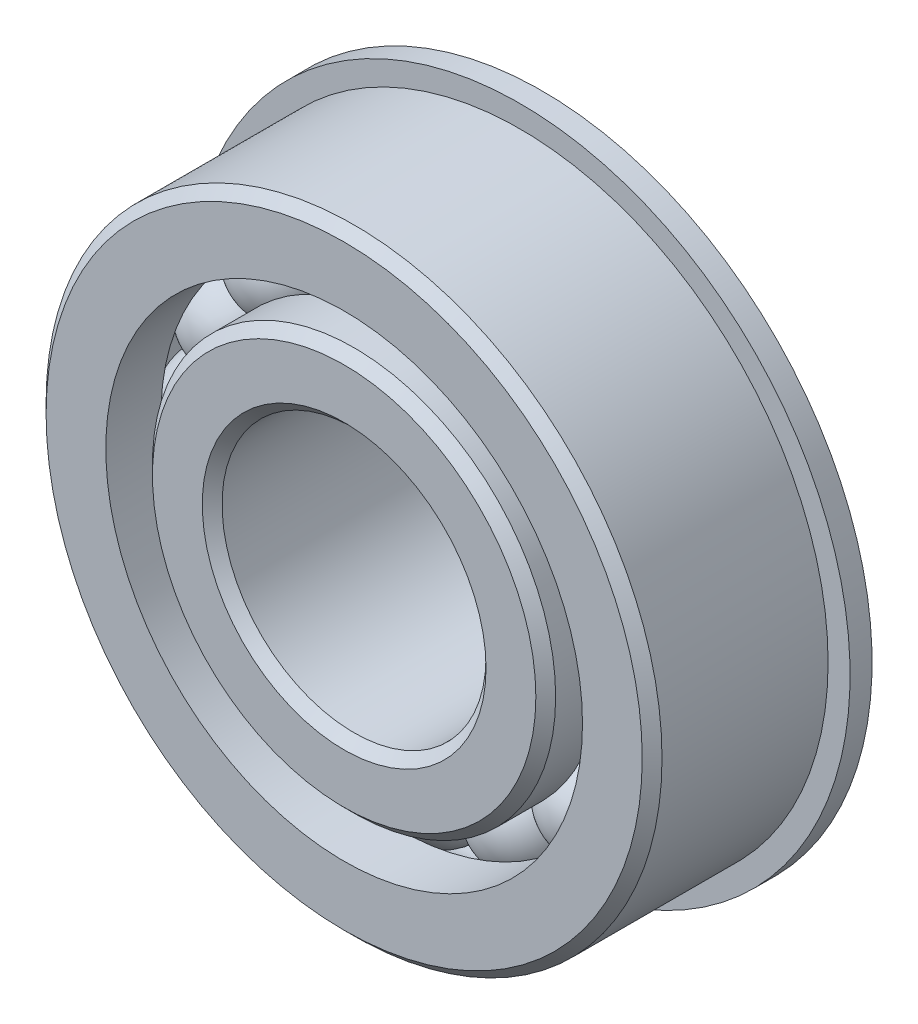
ISO-10303-21;
HEADER;
FILE_DESCRIPTION(('STEP AP214'),'2;1');
FILE_NAME('part.step','',(''),(''),'','','');
FILE_SCHEMA(('AUTOMOTIVE_DESIGN { 1 0 10303 214 1 1 1 1 }'));
ENDSEC;
DATA;
#1=APPLICATION_CONTEXT('core data for automotive mechanical design processes');
#2=APPLICATION_PROTOCOL_DEFINITION('international standard','automotive_design',2000,#1);
#3=PRODUCT_CONTEXT('',#1,'mechanical');
#4=PRODUCT('Part','Part','',(#3));
#5=PRODUCT_RELATED_PRODUCT_CATEGORY('part','',(#4));
#6=PRODUCT_DEFINITION_FORMATION('','',#4);
#7=PRODUCT_DEFINITION_CONTEXT('part definition',#1,'design');
#8=PRODUCT_DEFINITION('design','',#6,#7);
#9=PRODUCT_DEFINITION_SHAPE('','',#8);
#10=(LENGTH_UNIT() NAMED_UNIT(*) SI_UNIT(.MILLI.,.METRE.));
#11=(NAMED_UNIT(*) PLANE_ANGLE_UNIT() SI_UNIT($,.RADIAN.));
#12=(NAMED_UNIT(*) SI_UNIT($,.STERADIAN.) SOLID_ANGLE_UNIT());
#13=UNCERTAINTY_MEASURE_WITH_UNIT(LENGTH_MEASURE(1.E-05),#10,'distance_accuracy_value','');
#14=(GEOMETRIC_REPRESENTATION_CONTEXT(3) GLOBAL_UNCERTAINTY_ASSIGNED_CONTEXT((#13)) GLOBAL_UNIT_ASSIGNED_CONTEXT((#10,
#11,#12)) REPRESENTATION_CONTEXT('',''));
#15=CARTESIAN_POINT('',(0.,0.,0.));
#16=DIRECTION('',(0.,0.,1.));
#17=DIRECTION('',(1.,0.,0.));
#18=AXIS2_PLACEMENT_3D('',#15,#16,#17);
#19=CARTESIAN_POINT('',(-6.0750994887956,14.6665875786168,0.));
#20=DIRECTION('',(0.,0.,1.));
#21=DIRECTION('',(-0.382683432365077,0.923879532511292,0.));
#22=AXIS2_PLACEMENT_3D('',#19,#20,#21);
#23=SPHERICAL_SURFACE('',#22,3.44070265283123);
#24=CARTESIAN_POINT('',(-6.0750994887956,14.6665875786168,3.44070265283123));
#25=VERTEX_POINT('',#24);
#26=VERTEX_LOOP('',#25);
#27=FACE_BOUND('',#26,.T.);
#28=ADVANCED_FACE('F39',(#27),#23,.T.);
#29=CLOSED_SHELL('',(#28));
#30=MANIFOLD_SOLID_BREP('B2',#29);
#31=CARTESIAN_POINT('',(-11.2253201513363,11.2253201513366,0.));
#32=DIRECTION('',(0.,0.,1.));
#33=DIRECTION('',(-0.707106781186539,0.707106781186556,0.));
#34=AXIS2_PLACEMENT_3D('',#31,#32,#33);
#35=SPHERICAL_SURFACE('',#34,3.44070265283123);
#36=CARTESIAN_POINT('',(-11.2253201513363,11.2253201513366,3.44070265283123));
#37=VERTEX_POINT('',#36);
#38=VERTEX_LOOP('',#37);
#39=FACE_BOUND('',#38,.T.);
#40=ADVANCED_FACE('F59',(#39),#35,.T.);
#41=CLOSED_SHELL('',(#40));
#42=MANIFOLD_SOLID_BREP('B6',#41);
#43=CARTESIAN_POINT('',(-14.6665875786166,6.07509948879596,0.));
#44=DIRECTION('',(0.,0.,1.));
#45=DIRECTION('',(-0.923879532511283,0.3826834323651,0.));
#46=AXIS2_PLACEMENT_3D('',#43,#44,#45);
#47=SPHERICAL_SURFACE('',#46,3.44070265283123);
#48=CARTESIAN_POINT('',(-14.6665875786166,6.07509948879596,3.44070265283123));
#49=VERTEX_POINT('',#48);
#50=VERTEX_LOOP('',#49);
#51=FACE_BOUND('',#50,.T.);
#52=ADVANCED_FACE('F79',(#51),#47,.T.);
#53=CLOSED_SHELL('',(#52));
#54=MANIFOLD_SOLID_BREP('B35',#53);
#55=CARTESIAN_POINT('',(-15.875,1.66281798762404E-13,0.));
#56=DIRECTION('',(0.,0.,1.));
#57=DIRECTION('',(-1.,0.,0.));
#58=AXIS2_PLACEMENT_3D('',#55,#56,#57);
#59=SPHERICAL_SURFACE('',#58,3.44070265283123);
#60=CARTESIAN_POINT('',(-15.875,1.66281798762404E-13,3.44070265283123));
#61=VERTEX_POINT('',#60);
#62=VERTEX_LOOP('',#61);
#63=FACE_BOUND('',#62,.T.);
#64=ADVANCED_FACE('F99',(#63),#59,.T.);
#65=CLOSED_SHELL('',(#64));
#66=MANIFOLD_SOLID_BREP('B55',#65);
#67=CARTESIAN_POINT('',(-14.6665875786167,-6.07509948879565,0.));
#68=DIRECTION('',(0.,0.,1.));
#69=DIRECTION('',(-0.923879532511291,-0.382683432365081,0.));
#70=AXIS2_PLACEMENT_3D('',#67,#68,#69);
#71=SPHERICAL_SURFACE('',#70,3.44070265283123);
#72=CARTESIAN_POINT('',(-14.6665875786167,-6.07509948879565,3.44070265283123));
#73=VERTEX_POINT('',#72);
#74=VERTEX_LOOP('',#73);
#75=FACE_BOUND('',#74,.T.);
#76=ADVANCED_FACE('F119',(#75),#71,.T.);
#77=CLOSED_SHELL('',(#76));
#78=MANIFOLD_SOLID_BREP('B75',#77);
#79=CARTESIAN_POINT('',(-11.2253201513365,-11.2253201513363,0.));
#80=DIRECTION('',(0.,0.,1.));
#81=DIRECTION('',(-0.707106781186554,-0.707106781186541,0.));
#82=AXIS2_PLACEMENT_3D('',#79,#80,#81);
#83=SPHERICAL_SURFACE('',#82,3.44070265283123);
#84=CARTESIAN_POINT('',(-11.2253201513365,-11.2253201513363,3.44070265283123));
#85=VERTEX_POINT('',#84);
#86=VERTEX_LOOP('',#85);
#87=FACE_BOUND('',#86,.T.);
#88=ADVANCED_FACE('F139',(#87),#83,.T.);
#89=CLOSED_SHELL('',(#88));
#90=MANIFOLD_SOLID_BREP('B95',#89);
#91=CARTESIAN_POINT('',(-6.07509948879592,-14.6665875786166,0.));
#92=DIRECTION('',(0.,0.,1.));
#93=DIRECTION('',(-0.382683432365097,-0.923879532511284,0.));
#94=AXIS2_PLACEMENT_3D('',#91,#92,#93);
#95=SPHERICAL_SURFACE('',#94,3.44070265283123);
#96=CARTESIAN_POINT('',(-6.07509948879592,-14.6665875786166,3.44070265283123));
#97=VERTEX_POINT('',#96);
#98=VERTEX_LOOP('',#97);
#99=FACE_BOUND('',#98,.T.);
#100=ADVANCED_FACE('F159',(#99),#95,.T.);
#101=CLOSED_SHELL('',(#100));
#102=MANIFOLD_SOLID_BREP('B115',#101);
#103=CARTESIAN_POINT('',(-1.10854532508269E-13,-15.875,0.));
#104=DIRECTION('',(0.,0.,1.));
#105=DIRECTION('',(0.,-1.,0.));
#106=AXIS2_PLACEMENT_3D('',#103,#104,#105);
#107=SPHERICAL_SURFACE('',#106,3.44070265283123);
#108=CARTESIAN_POINT('',(-1.10854532508269E-13,-15.875,3.44070265283123));
#109=VERTEX_POINT('',#108);
#110=VERTEX_LOOP('',#109);
#111=FACE_BOUND('',#110,.T.);
#112=ADVANCED_FACE('F179',(#111),#107,.T.);
#113=CLOSED_SHELL('',(#112));
#114=MANIFOLD_SOLID_BREP('B135',#113);
#115=CARTESIAN_POINT('',(6.07509948879571,-14.6665875786167,0.));
#116=DIRECTION('',(0.,0.,1.));
#117=DIRECTION('',(0.382683432365084,-0.923879532511289,0.));
#118=AXIS2_PLACEMENT_3D('',#115,#116,#117);
#119=SPHERICAL_SURFACE('',#118,3.44070265283123);
#120=CARTESIAN_POINT('',(6.07509948879571,-14.6665875786167,3.44070265283123));
#121=VERTEX_POINT('',#120);
#122=VERTEX_LOOP('',#121);
#123=FACE_BOUND('',#122,.T.);
#124=ADVANCED_FACE('F199',(#123),#119,.T.);
#125=CLOSED_SHELL('',(#124));
#126=MANIFOLD_SOLID_BREP('B155',#125);
#127=CARTESIAN_POINT('',(11.2253201513364,-11.2253201513365,0.));
#128=DIRECTION('',(0.,0.,1.));
#129=DIRECTION('',(0.707106781186544,-0.707106781186551,0.));
#130=AXIS2_PLACEMENT_3D('',#127,#128,#129);
#131=SPHERICAL_SURFACE('',#130,3.44070265283123);
#132=CARTESIAN_POINT('',(11.2253201513364,-11.2253201513365,3.44070265283123));
#133=VERTEX_POINT('',#132);
#134=VERTEX_LOOP('',#133);
#135=FACE_BOUND('',#134,.T.);
#136=ADVANCED_FACE('F219',(#135),#131,.T.);
#137=CLOSED_SHELL('',(#136));
#138=MANIFOLD_SOLID_BREP('B175',#137);
#139=CARTESIAN_POINT('',(14.6665875786167,-6.07509948879586,0.));
#140=DIRECTION('',(0.,0.,1.));
#141=DIRECTION('',(0.923879532511285,-0.382683432365094,0.));
#142=AXIS2_PLACEMENT_3D('',#139,#140,#141);
#143=SPHERICAL_SURFACE('',#142,3.44070265283123);
#144=CARTESIAN_POINT('',(14.6665875786167,-6.07509948879586,3.44070265283123));
#145=VERTEX_POINT('',#144);
#146=VERTEX_LOOP('',#145);
#147=FACE_BOUND('',#146,.T.);
#148=ADVANCED_FACE('F239',(#147),#143,.T.);
#149=CLOSED_SHELL('',(#148));
#150=MANIFOLD_SOLID_BREP('B195',#149);
#151=CARTESIAN_POINT('',(15.875,0.,0.));
#152=DIRECTION('',(0.,0.,1.));
#153=DIRECTION('',(1.,0.,0.));
#154=AXIS2_PLACEMENT_3D('',#151,#152,#153);
#155=SPHERICAL_SURFACE('',#154,3.44070265283123);
#156=CARTESIAN_POINT('',(15.875,0.,3.44070265283123));
#157=VERTEX_POINT('',#156);
#158=VERTEX_LOOP('',#157);
#159=FACE_BOUND('',#158,.T.);
#160=ADVANCED_FACE('F259',(#159),#155,.T.);
#161=CLOSED_SHELL('',(#160));
#162=MANIFOLD_SOLID_BREP('B215',#161);
#163=CARTESIAN_POINT('',(14.6665875786167,6.07509948879576,0.));
#164=DIRECTION('',(0.,0.,1.));
#165=DIRECTION('',(0.923879532511288,0.382683432365087,0.));
#166=AXIS2_PLACEMENT_3D('',#163,#164,#165);
#167=SPHERICAL_SURFACE('',#166,3.44070265283123);
#168=CARTESIAN_POINT('',(14.6665875786167,6.07509948879576,3.44070265283123));
#169=VERTEX_POINT('',#168);
#170=VERTEX_LOOP('',#169);
#171=FACE_BOUND('',#170,.T.);
#172=ADVANCED_FACE('F279',(#171),#167,.T.);
#173=CLOSED_SHELL('',(#172));
#174=MANIFOLD_SOLID_BREP('B235',#173);
#175=CARTESIAN_POINT('',(11.2253201513365,11.2253201513364,0.));
#176=DIRECTION('',(0.,0.,1.));
#177=DIRECTION('',(0.707106781186549,0.707106781186546,0.));
#178=AXIS2_PLACEMENT_3D('',#175,#176,#177);
#179=SPHERICAL_SURFACE('',#178,3.44070265283123);
#180=CARTESIAN_POINT('',(11.2253201513365,11.2253201513364,3.44070265283123));
#181=VERTEX_POINT('',#180);
#182=VERTEX_LOOP('',#181);
#183=FACE_BOUND('',#182,.T.);
#184=ADVANCED_FACE('F299',(#183),#179,.T.);
#185=CLOSED_SHELL('',(#184));
#186=MANIFOLD_SOLID_BREP('B255',#185);
#187=CARTESIAN_POINT('',(6.07509948879581,14.6665875786167,0.));
#188=DIRECTION('',(0.,0.,1.));
#189=DIRECTION('',(0.382683432365091,0.923879532511287,0.));
#190=AXIS2_PLACEMENT_3D('',#187,#188,#189);
#191=SPHERICAL_SURFACE('',#190,3.44070265283123);
#192=CARTESIAN_POINT('',(6.07509948879581,14.6665875786167,3.44070265283123));
#193=VERTEX_POINT('',#192);
#194=VERTEX_LOOP('',#193);
#195=FACE_BOUND('',#194,.T.);
#196=ADVANCED_FACE('F319',(#195),#191,.T.);
#197=CLOSED_SHELL('',(#196));
#198=MANIFOLD_SOLID_BREP('B275',#197);
#199=CARTESIAN_POINT('',(0.,15.875,0.));
#200=DIRECTION('',(0.,0.,1.));
#201=DIRECTION('',(0.,1.,0.));
#202=AXIS2_PLACEMENT_3D('',#199,#200,#201);
#203=SPHERICAL_SURFACE('',#202,3.44070265283123);
#204=CARTESIAN_POINT('',(0.,15.875,3.44070265283123));
#205=VERTEX_POINT('',#204);
#206=VERTEX_LOOP('',#205);
#207=FACE_BOUND('',#206,.T.);
#208=ADVANCED_FACE('F341',(#207),#203,.T.);
#209=CLOSED_SHELL('',(#208));
#210=MANIFOLD_SOLID_BREP('B295',#209);
#211=CARTESIAN_POINT('',(0.,0.,6.429375));
#212=DIRECTION('',(0.,0.,-1.));
#213=DIRECTION('',(-1.,0.,0.));
#214=AXIS2_PLACEMENT_3D('',#211,#212,#213);
#215=CONICAL_SURFACE('',#214,14.5491758241758,0.785398163397451);
#216=CARTESIAN_POINT('',(0.,0.,7.14375));
#217=DIRECTION('',(0.,0.,1.));
#218=DIRECTION('',(1.,0.,0.));
#219=AXIS2_PLACEMENT_3D('',#216,#217,#218);
#220=CIRCLE('',#219,13.8348008241758);
#221=CARTESIAN_POINT('',(13.8348008241758,0.,7.14375));
#222=VERTEX_POINT('',#221);
#223=EDGE_CURVE('E394',#222,#222,#220,.T.);
#224=ORIENTED_EDGE('',*,*,#223,.F.);
#225=EDGE_LOOP('',(#224));
#226=FACE_BOUND('',#225,.T.);
#227=CARTESIAN_POINT('',(0.,0.,6.429375));
#228=DIRECTION('',(0.,0.,1.));
#229=DIRECTION('',(1.,0.,0.));
#230=AXIS2_PLACEMENT_3D('',#227,#228,#229);
#231=CIRCLE('',#230,14.5491758241758);
#232=CARTESIAN_POINT('',(14.5491758241758,0.,6.429375));
#233=VERTEX_POINT('',#232);
#234=EDGE_CURVE('E340',#233,#233,#231,.T.);
#235=ORIENTED_EDGE('',*,*,#234,.T.);
#236=EDGE_LOOP('',(#235));
#237=FACE_BOUND('',#236,.T.);
#238=ADVANCED_FACE('F360',(#226,#237),#215,.T.);
#239=CARTESIAN_POINT('',(0.,0.,7.14375));
#240=DIRECTION('',(0.,0.,1.));
#241=DIRECTION('',(1.,0.,0.));
#242=AXIS2_PLACEMENT_3D('',#239,#240,#241);
#243=CYLINDRICAL_SURFACE('',#242,14.5491758241758);
#244=ORIENTED_EDGE('',*,*,#234,.F.);
#245=EDGE_LOOP('',(#244));
#246=FACE_BOUND('',#245,.T.);
#247=CARTESIAN_POINT('',(0.,0.,3.175));
#248=DIRECTION('',(0.,0.,1.));
#249=DIRECTION('',(1.,0.,0.));
#250=AXIS2_PLACEMENT_3D('',#247,#248,#249);
#251=CIRCLE('',#250,14.5491758241758);
#252=CARTESIAN_POINT('',(14.5491758241758,0.,3.175));
#253=VERTEX_POINT('',#252);
#254=EDGE_CURVE('E366',#253,#253,#251,.T.);
#255=ORIENTED_EDGE('',*,*,#254,.T.);
#256=EDGE_LOOP('',(#255));
#257=FACE_BOUND('',#256,.T.);
#258=ADVANCED_FACE('F401',(#246,#257),#243,.T.);
#259=CARTESIAN_POINT('',(0.,0.,0.));
#260=DIRECTION('',(0.,0.,1.));
#261=DIRECTION('',(1.,0.,0.));
#262=AXIS2_PLACEMENT_3D('',#259,#260,#261);
#263=TOROIDAL_SURFACE('',#262,15.875,3.44070265283122);
#264=ORIENTED_EDGE('',*,*,#254,.F.);
#265=EDGE_LOOP('',(#264));
#266=FACE_BOUND('',#265,.T.);
#267=CARTESIAN_POINT('',(0.,0.,-3.175));
#268=DIRECTION('',(0.,0.,1.));
#269=DIRECTION('',(1.,0.,0.));
#270=AXIS2_PLACEMENT_3D('',#267,#268,#269);
#271=CIRCLE('',#270,14.5491758241758);
#272=CARTESIAN_POINT('',(14.5491758241758,0.,-3.175));
#273=VERTEX_POINT('',#272);
#274=EDGE_CURVE('E370',#273,#273,#271,.T.);
#275=ORIENTED_EDGE('',*,*,#274,.T.);
#276=EDGE_LOOP('',(#275));
#277=FACE_BOUND('',#276,.T.);
#278=ADVANCED_FACE('F405',(#266,#277),#263,.F.);
#279=CARTESIAN_POINT('',(0.,0.,7.14375));
#280=DIRECTION('',(0.,0.,1.));
#281=DIRECTION('',(1.,0.,0.));
#282=AXIS2_PLACEMENT_3D('',#279,#280,#281);
#283=CYLINDRICAL_SURFACE('',#282,14.5491758241758);
#284=ORIENTED_EDGE('',*,*,#274,.F.);
#285=EDGE_LOOP('',(#284));
#286=FACE_BOUND('',#285,.T.);
#287=CARTESIAN_POINT('',(0.,0.,-8.016875));
#288=DIRECTION('',(0.,0.,1.));
#289=DIRECTION('',(1.,0.,0.));
#290=AXIS2_PLACEMENT_3D('',#287,#288,#289);
#291=CIRCLE('',#290,14.5491758241758);
#292=CARTESIAN_POINT('',(14.5491758241758,0.,-8.016875));
#293=VERTEX_POINT('',#292);
#294=EDGE_CURVE('E374',#293,#293,#291,.T.);
#295=ORIENTED_EDGE('',*,*,#294,.T.);
#296=EDGE_LOOP('',(#295));
#297=FACE_BOUND('',#296,.T.);
#298=ADVANCED_FACE('F410',(#286,#297),#283,.T.);
#299=CARTESIAN_POINT('',(0.,0.,-8.73125));
#300=DIRECTION('',(0.,0.,1.));
#301=DIRECTION('',(1.,0.,0.));
#302=AXIS2_PLACEMENT_3D('',#299,#300,#301);
#303=CONICAL_SURFACE('',#302,13.8348008241758,0.785398163397448);
#304=ORIENTED_EDGE('',*,*,#294,.F.);
#305=EDGE_LOOP('',(#304));
#306=FACE_BOUND('',#305,.T.);
#307=CARTESIAN_POINT('',(0.,0.,-8.73125));
#308=DIRECTION('',(0.,0.,1.));
#309=DIRECTION('',(1.,0.,0.));
#310=AXIS2_PLACEMENT_3D('',#307,#308,#309);
#311=CIRCLE('',#310,13.8348008241758);
#312=CARTESIAN_POINT('',(13.8348008241758,0.,-8.73125));
#313=VERTEX_POINT('',#312);
#314=EDGE_CURVE('E379',#313,#313,#311,.T.);
#315=ORIENTED_EDGE('',*,*,#314,.T.);
#316=EDGE_LOOP('',(#315));
#317=FACE_BOUND('',#316,.T.);
#318=ADVANCED_FACE('F416',(#306,#317),#303,.T.);
#319=CARTESIAN_POINT('',(0.,13.8348008241758,-8.73125));
#320=DIRECTION('',(0.,0.,1.));
#321=DIRECTION('',(1.,0.,0.));
#322=AXIS2_PLACEMENT_3D('',#319,#320,#321);
#323=PLANE('',#322);
#324=ORIENTED_EDGE('',*,*,#314,.F.);
#325=EDGE_LOOP('',(#324));
#326=FACE_BOUND('',#325,.T.);
#327=CARTESIAN_POINT('',(0.,0.,-8.73125));
#328=DIRECTION('',(0.,0.,1.));
#329=DIRECTION('',(1.,0.,0.));
#330=AXIS2_PLACEMENT_3D('',#327,#328,#329);
#331=CIRCLE('',#330,10.239375);
#332=CARTESIAN_POINT('',(10.239375,0.,-8.73125));
#333=VERTEX_POINT('',#332);
#334=EDGE_CURVE('E382',#333,#333,#331,.T.);
#335=ORIENTED_EDGE('',*,*,#334,.T.);
#336=EDGE_LOOP('',(#335));
#337=FACE_BOUND('',#336,.T.);
#338=ADVANCED_FACE('F420',(#326,#337),#323,.F.);
#339=CARTESIAN_POINT('',(0.,0.,-8.016875));
#340=DIRECTION('',(0.,0.,-1.));
#341=DIRECTION('',(-1.,0.,0.));
#342=AXIS2_PLACEMENT_3D('',#339,#340,#341);
#343=CONICAL_SURFACE('',#342,9.525,0.785398163397447);
#344=ORIENTED_EDGE('',*,*,#334,.F.);
#345=EDGE_LOOP('',(#344));
#346=FACE_BOUND('',#345,.T.);
#347=CARTESIAN_POINT('',(0.,0.,-8.016875));
#348=DIRECTION('',(0.,0.,1.));
#349=DIRECTION('',(1.,0.,0.));
#350=AXIS2_PLACEMENT_3D('',#347,#348,#349);
#351=CIRCLE('',#350,9.525);
#352=CARTESIAN_POINT('',(9.525,0.,-8.016875));
#353=VERTEX_POINT('',#352);
#354=EDGE_CURVE('E385',#353,#353,#351,.T.);
#355=ORIENTED_EDGE('',*,*,#354,.T.);
#356=EDGE_LOOP('',(#355));
#357=FACE_BOUND('',#356,.T.);
#358=ADVANCED_FACE('F424',(#346,#357),#343,.F.);
#359=CARTESIAN_POINT('',(0.,0.,7.14375));
#360=DIRECTION('',(0.,0.,1.));
#361=DIRECTION('',(1.,0.,0.));
#362=AXIS2_PLACEMENT_3D('',#359,#360,#361);
#363=CYLINDRICAL_SURFACE('',#362,9.525);
#364=ORIENTED_EDGE('',*,*,#354,.F.);
#365=EDGE_LOOP('',(#364));
#366=FACE_BOUND('',#365,.T.);
#367=CARTESIAN_POINT('',(0.,0.,6.429375));
#368=DIRECTION('',(0.,0.,1.));
#369=DIRECTION('',(1.,0.,0.));
#370=AXIS2_PLACEMENT_3D('',#367,#368,#369);
#371=CIRCLE('',#370,9.525);
#372=CARTESIAN_POINT('',(9.525,0.,6.429375));
#373=VERTEX_POINT('',#372);
#374=EDGE_CURVE('E388',#373,#373,#371,.T.);
#375=ORIENTED_EDGE('',*,*,#374,.T.);
#376=EDGE_LOOP('',(#375));
#377=FACE_BOUND('',#376,.T.);
#378=ADVANCED_FACE('F428',(#366,#377),#363,.F.);
#379=CARTESIAN_POINT('',(0.,0.,7.14375));
#380=DIRECTION('',(0.,0.,1.));
#381=DIRECTION('',(1.,0.,0.));
#382=AXIS2_PLACEMENT_3D('',#379,#380,#381);
#383=CONICAL_SURFACE('',#382,10.239375,0.785398163397451);
#384=ORIENTED_EDGE('',*,*,#374,.F.);
#385=EDGE_LOOP('',(#384));
#386=FACE_BOUND('',#385,.T.);
#387=CARTESIAN_POINT('',(0.,0.,7.14375));
#388=DIRECTION('',(0.,0.,1.));
#389=DIRECTION('',(1.,0.,0.));
#390=AXIS2_PLACEMENT_3D('',#387,#388,#389);
#391=CIRCLE('',#390,10.239375);
#392=CARTESIAN_POINT('',(10.239375,0.,7.14375));
#393=VERTEX_POINT('',#392);
#394=EDGE_CURVE('E391',#393,#393,#391,.T.);
#395=ORIENTED_EDGE('',*,*,#394,.T.);
#396=EDGE_LOOP('',(#395));
#397=FACE_BOUND('',#396,.T.);
#398=ADVANCED_FACE('F432',(#386,#397),#383,.F.);
#399=CARTESIAN_POINT('',(0.,10.239375,7.14375));
#400=DIRECTION('',(0.,0.,-1.));
#401=DIRECTION('',(-1.,0.,0.));
#402=AXIS2_PLACEMENT_3D('',#399,#400,#401);
#403=PLANE('',#402);
#404=ORIENTED_EDGE('',*,*,#394,.F.);
#405=EDGE_LOOP('',(#404));
#406=FACE_BOUND('',#405,.T.);
#407=ORIENTED_EDGE('',*,*,#223,.T.);
#408=EDGE_LOOP('',(#407));
#409=FACE_BOUND('',#408,.T.);
#410=ADVANCED_FACE('F398',(#406,#409),#403,.F.);
#411=CLOSED_SHELL('',(#238,#258,#278,#298,#318,#338,#358,#378,#398,#410));
#412=MANIFOLD_SOLID_BREP('B315',#411);
#413=CARTESIAN_POINT('',(0.,0.,6.429375));
#414=DIRECTION('',(0.,0.,-1.));
#415=DIRECTION('',(-1.,0.,0.));
#416=AXIS2_PLACEMENT_3D('',#413,#414,#415);
#417=CONICAL_SURFACE('',#416,22.225,0.785398163397451);
#418=CARTESIAN_POINT('',(0.,0.,7.14375));
#419=DIRECTION('',(0.,0.,1.));
#420=DIRECTION('',(1.,0.,0.));
#421=AXIS2_PLACEMENT_3D('',#418,#419,#420);
#422=CIRCLE('',#421,21.510625);
#423=CARTESIAN_POINT('',(21.510625,0.,7.14375));
#424=VERTEX_POINT('',#423);
#425=EDGE_CURVE('E533',#424,#424,#422,.T.);
#426=ORIENTED_EDGE('',*,*,#425,.F.);
#427=EDGE_LOOP('',(#426));
#428=FACE_BOUND('',#427,.T.);
#429=CARTESIAN_POINT('',(0.,0.,6.429375));
#430=DIRECTION('',(0.,0.,1.));
#431=DIRECTION('',(1.,0.,0.));
#432=AXIS2_PLACEMENT_3D('',#429,#430,#431);
#433=CIRCLE('',#432,22.225);
#434=CARTESIAN_POINT('',(22.225,0.,6.429375));
#435=VERTEX_POINT('',#434);
#436=EDGE_CURVE('E359',#435,#435,#433,.T.);
#437=ORIENTED_EDGE('',*,*,#436,.T.);
#438=EDGE_LOOP('',(#437));
#439=FACE_BOUND('',#438,.T.);
#440=ADVANCED_FACE('F511',(#428,#439),#417,.T.);
#441=CARTESIAN_POINT('',(0.,0.,7.14375));
#442=DIRECTION('',(0.,0.,1.));
#443=DIRECTION('',(1.,0.,0.));
#444=AXIS2_PLACEMENT_3D('',#441,#442,#443);
#445=CYLINDRICAL_SURFACE('',#444,22.225);
#446=CARTESIAN_POINT('',(0.,0.,-5.55625));
#447=DIRECTION('',(0.,0.,1.));
#448=DIRECTION('',(1.,0.,0.));
#449=AXIS2_PLACEMENT_3D('',#446,#447,#448);
#450=CIRCLE('',#449,22.225);
#451=CARTESIAN_POINT('',(22.225,0.,-5.55625));
#452=VERTEX_POINT('',#451);
#453=EDGE_CURVE('E536',#452,#452,#450,.T.);
#454=ORIENTED_EDGE('',*,*,#453,.T.);
#455=EDGE_LOOP('',(#454));
#456=FACE_BOUND('',#455,.T.);
#457=ORIENTED_EDGE('',*,*,#436,.F.);
#458=EDGE_LOOP('',(#457));
#459=FACE_BOUND('',#458,.T.);
#460=ADVANCED_FACE('F556',(#456,#459),#445,.T.);
#461=CARTESIAN_POINT('',(0.,21.510625,-7.14375));
#462=DIRECTION('',(0.,0.,1.));
#463=DIRECTION('',(1.,0.,0.));
#464=AXIS2_PLACEMENT_3D('',#461,#462,#463);
#465=PLANE('',#464);
#466=CARTESIAN_POINT('',(0.,0.,-7.14375));
#467=DIRECTION('',(0.,0.,1.));
#468=DIRECTION('',(1.,0.,0.));
#469=AXIS2_PLACEMENT_3D('',#466,#467,#468);
#470=CIRCLE('',#469,17.2008241758242);
#471=CARTESIAN_POINT('',(17.2008241758242,0.,-7.14375));
#472=VERTEX_POINT('',#471);
#473=EDGE_CURVE('E517',#472,#472,#470,.T.);
#474=ORIENTED_EDGE('',*,*,#473,.T.);
#475=EDGE_LOOP('',(#474));
#476=FACE_BOUND('',#475,.T.);
#477=CARTESIAN_POINT('',(0.,0.,-7.14375));
#478=DIRECTION('',(0.,0.,-1.));
#479=DIRECTION('',(-1.,0.,0.));
#480=AXIS2_PLACEMENT_3D('',#477,#478,#479);
#481=CIRCLE('',#480,23.8125);
#482=CARTESIAN_POINT('',(-23.8125,0.,-7.14375));
#483=VERTEX_POINT('',#482);
#484=EDGE_CURVE('E539',#483,#483,#481,.T.);
#485=ORIENTED_EDGE('',*,*,#484,.T.);
#486=EDGE_LOOP('',(#485));
#487=FACE_BOUND('',#486,.T.);
#488=ADVANCED_FACE('F559',(#476,#487),#465,.F.);
#489=CARTESIAN_POINT('',(0.,0.,7.14375));
#490=DIRECTION('',(0.,0.,1.));
#491=DIRECTION('',(1.,0.,0.));
#492=AXIS2_PLACEMENT_3D('',#489,#490,#491);
#493=CYLINDRICAL_SURFACE('',#492,17.2008241758242);
#494=CARTESIAN_POINT('',(0.,0.,-3.175));
#495=DIRECTION('',(0.,0.,1.));
#496=DIRECTION('',(1.,0.,0.));
#497=AXIS2_PLACEMENT_3D('',#494,#495,#496);
#498=CIRCLE('',#497,17.2008241758242);
#499=CARTESIAN_POINT('',(17.2008241758242,0.,-3.175));
#500=VERTEX_POINT('',#499);
#501=EDGE_CURVE('E521',#500,#500,#498,.T.);
#502=ORIENTED_EDGE('',*,*,#501,.T.);
#503=EDGE_LOOP('',(#502));
#504=FACE_BOUND('',#503,.T.);
#505=ORIENTED_EDGE('',*,*,#473,.F.);
#506=EDGE_LOOP('',(#505));
#507=FACE_BOUND('',#506,.T.);
#508=ADVANCED_FACE('F564',(#504,#507),#493,.F.);
#509=CARTESIAN_POINT('',(0.,0.,0.));
#510=DIRECTION('',(0.,0.,1.));
#511=DIRECTION('',(1.,0.,0.));
#512=AXIS2_PLACEMENT_3D('',#509,#510,#511);
#513=TOROIDAL_SURFACE('',#512,15.875,3.44070265283123);
#514=ORIENTED_EDGE('',*,*,#501,.F.);
#515=EDGE_LOOP('',(#514));
#516=FACE_BOUND('',#515,.T.);
#517=CARTESIAN_POINT('',(0.,0.,3.175));
#518=DIRECTION('',(0.,0.,1.));
#519=DIRECTION('',(1.,0.,0.));
#520=AXIS2_PLACEMENT_3D('',#517,#518,#519);
#521=CIRCLE('',#520,17.2008241758242);
#522=CARTESIAN_POINT('',(17.2008241758242,0.,3.175));
#523=VERTEX_POINT('',#522);
#524=EDGE_CURVE('E525',#523,#523,#521,.T.);
#525=ORIENTED_EDGE('',*,*,#524,.T.);
#526=EDGE_LOOP('',(#525));
#527=FACE_BOUND('',#526,.T.);
#528=ADVANCED_FACE('F570',(#516,#527),#513,.F.);
#529=CARTESIAN_POINT('',(0.,0.,7.14375));
#530=DIRECTION('',(0.,0.,1.));
#531=DIRECTION('',(1.,0.,0.));
#532=AXIS2_PLACEMENT_3D('',#529,#530,#531);
#533=CYLINDRICAL_SURFACE('',#532,17.2008241758242);
#534=ORIENTED_EDGE('',*,*,#524,.F.);
#535=EDGE_LOOP('',(#534));
#536=FACE_BOUND('',#535,.T.);
#537=CARTESIAN_POINT('',(0.,0.,7.14375));
#538=DIRECTION('',(0.,0.,1.));
#539=DIRECTION('',(1.,0.,0.));
#540=AXIS2_PLACEMENT_3D('',#537,#538,#539);
#541=CIRCLE('',#540,17.2008241758242);
#542=CARTESIAN_POINT('',(17.2008241758242,0.,7.14375));
#543=VERTEX_POINT('',#542);
#544=EDGE_CURVE('E530',#543,#543,#541,.T.);
#545=ORIENTED_EDGE('',*,*,#544,.T.);
#546=EDGE_LOOP('',(#545));
#547=FACE_BOUND('',#546,.T.);
#548=ADVANCED_FACE('F574',(#536,#547),#533,.F.);
#549=CARTESIAN_POINT('',(0.,21.510625,7.14375));
#550=DIRECTION('',(0.,0.,-1.));
#551=DIRECTION('',(-1.,0.,0.));
#552=AXIS2_PLACEMENT_3D('',#549,#550,#551);
#553=PLANE('',#552);
#554=ORIENTED_EDGE('',*,*,#544,.F.);
#555=EDGE_LOOP('',(#554));
#556=FACE_BOUND('',#555,.T.);
#557=ORIENTED_EDGE('',*,*,#425,.T.);
#558=EDGE_LOOP('',(#557));
#559=FACE_BOUND('',#558,.T.);
#560=ADVANCED_FACE('F552',(#556,#559),#553,.F.);
#561=CARTESIAN_POINT('',(0.,17.2008241758242,-5.55625));
#562=DIRECTION('',(0.,0.,1.));
#563=DIRECTION('',(1.,0.,0.));
#564=AXIS2_PLACEMENT_3D('',#561,#562,#563);
#565=PLANE('',#564);
#566=CARTESIAN_POINT('',(0.,0.,-5.55625));
#567=DIRECTION('',(0.,0.,-1.));
#568=DIRECTION('',(-1.,0.,0.));
#569=AXIS2_PLACEMENT_3D('',#566,#567,#568);
#570=CIRCLE('',#569,23.8125);
#571=CARTESIAN_POINT('',(-23.8125,0.,-5.55625));
#572=VERTEX_POINT('',#571);
#573=EDGE_CURVE('E542',#572,#572,#570,.T.);
#574=ORIENTED_EDGE('',*,*,#573,.F.);
#575=EDGE_LOOP('',(#574));
#576=FACE_BOUND('',#575,.T.);
#577=ORIENTED_EDGE('',*,*,#453,.F.);
#578=EDGE_LOOP('',(#577));
#579=FACE_BOUND('',#578,.T.);
#580=ADVANCED_FACE('F549',(#576,#579),#565,.T.);
#581=CARTESIAN_POINT('',(0.,0.,-7.14375));
#582=DIRECTION('',(0.,0.,-1.));
#583=DIRECTION('',(-1.,0.,0.));
#584=AXIS2_PLACEMENT_3D('',#581,#582,#583);
#585=CYLINDRICAL_SURFACE('',#584,23.8125);
#586=ORIENTED_EDGE('',*,*,#573,.T.);
#587=EDGE_LOOP('',(#586));
#588=FACE_BOUND('',#587,.T.);
#589=ORIENTED_EDGE('',*,*,#484,.F.);
#590=EDGE_LOOP('',(#589));
#591=FACE_BOUND('',#590,.T.);
#592=ADVANCED_FACE('F546',(#588,#591),#585,.T.);
#593=CLOSED_SHELL('',(#440,#460,#488,#508,#528,#548,#560,#580,#592));
#594=MANIFOLD_SOLID_BREP('B335',#593);
#595=ADVANCED_BREP_SHAPE_REPRESENTATION('',(#18,#30,#42,#54,#66,#78,#90,#102,#114,#126,#138,
#150,#162,#174,#186,#198,#210,#412,#594),#14);
#596=SHAPE_DEFINITION_REPRESENTATION(#9,#595);
ENDSEC;
END-ISO-10303-21;
